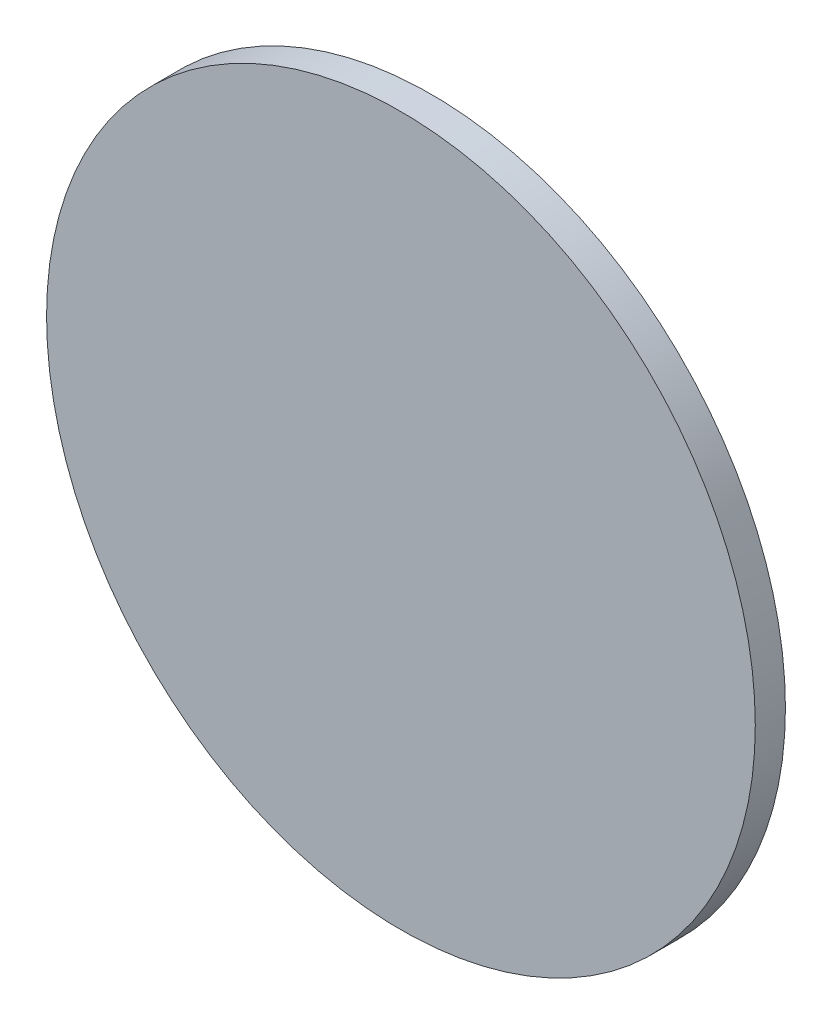
ISO-10303-21;
HEADER;
FILE_DESCRIPTION(('STEP AP214'),'2;1');
FILE_NAME('part.step','',(''),(''),'','','');
FILE_SCHEMA(('AUTOMOTIVE_DESIGN { 1 0 10303 214 1 1 1 1 }'));
ENDSEC;
DATA;
#1=APPLICATION_CONTEXT('core data for automotive mechanical design processes');
#2=APPLICATION_PROTOCOL_DEFINITION('international standard','automotive_design',2000,#1);
#3=PRODUCT_CONTEXT('',#1,'mechanical');
#4=PRODUCT('Part','Part','',(#3));
#5=PRODUCT_RELATED_PRODUCT_CATEGORY('part','',(#4));
#6=PRODUCT_DEFINITION_FORMATION('','',#4);
#7=PRODUCT_DEFINITION_CONTEXT('part definition',#1,'design');
#8=PRODUCT_DEFINITION('design','',#6,#7);
#9=PRODUCT_DEFINITION_SHAPE('','',#8);
#10=(LENGTH_UNIT() NAMED_UNIT(*) SI_UNIT(.MILLI.,.METRE.));
#11=(NAMED_UNIT(*) PLANE_ANGLE_UNIT() SI_UNIT($,.RADIAN.));
#12=(NAMED_UNIT(*) SI_UNIT($,.STERADIAN.) SOLID_ANGLE_UNIT());
#13=UNCERTAINTY_MEASURE_WITH_UNIT(LENGTH_MEASURE(1.E-05),#10,'distance_accuracy_value','');
#14=(GEOMETRIC_REPRESENTATION_CONTEXT(3) GLOBAL_UNCERTAINTY_ASSIGNED_CONTEXT((#13)) GLOBAL_UNIT_ASSIGNED_CONTEXT((#10,
#11,#12)) REPRESENTATION_CONTEXT('',''));
#15=CARTESIAN_POINT('',(0.,0.,0.));
#16=DIRECTION('',(0.,0.,1.));
#17=DIRECTION('',(1.,0.,0.));
#18=AXIS2_PLACEMENT_3D('',#15,#16,#17);
#19=CARTESIAN_POINT('',(0.,0.,0.81));
#20=DIRECTION('',(0.,0.,-1.));
#21=DIRECTION('',(-1.,0.,0.));
#22=AXIS2_PLACEMENT_3D('',#19,#20,#21);
#23=CYLINDRICAL_SURFACE('',#22,9.525);
#24=CARTESIAN_POINT('',(0.,0.,0.81));
#25=DIRECTION('',(0.,0.,1.));
#26=DIRECTION('',(1.,0.,0.));
#27=AXIS2_PLACEMENT_3D('',#24,#25,#26);
#28=CIRCLE('',#27,9.525);
#29=CARTESIAN_POINT('',(9.525,0.,0.81));
#30=VERTEX_POINT('',#29);
#31=EDGE_CURVE('E10',#30,#30,#28,.T.);
#32=ORIENTED_EDGE('',*,*,#31,.F.);
#33=EDGE_LOOP('',(#32));
#34=FACE_BOUND('',#33,.T.);
#35=CARTESIAN_POINT('',(0.,0.,0.));
#36=DIRECTION('',(0.,0.,1.));
#37=DIRECTION('',(1.,0.,0.));
#38=AXIS2_PLACEMENT_3D('',#35,#36,#37);
#39=CIRCLE('',#38,9.525);
#40=CARTESIAN_POINT('',(9.525,0.,0.));
#41=VERTEX_POINT('',#40);
#42=EDGE_CURVE('E31',#41,#41,#39,.T.);
#43=ORIENTED_EDGE('',*,*,#42,.T.);
#44=EDGE_LOOP('',(#43));
#45=FACE_BOUND('',#44,.T.);
#46=ADVANCED_FACE('F28',(#34,#45),#23,.T.);
#47=CARTESIAN_POINT('',(0.,0.,0.81));
#48=DIRECTION('',(0.,0.,1.));
#49=DIRECTION('',(1.,0.,0.));
#50=AXIS2_PLACEMENT_3D('',#47,#48,#49);
#51=PLANE('',#50);
#52=ORIENTED_EDGE('',*,*,#31,.T.);
#53=EDGE_LOOP('',(#52));
#54=FACE_BOUND('',#53,.T.);
#55=ADVANCED_FACE('F43',(#54),#51,.T.);
#56=CARTESIAN_POINT('',(0.,0.,0.));
#57=DIRECTION('',(0.,0.,1.));
#58=DIRECTION('',(1.,0.,0.));
#59=AXIS2_PLACEMENT_3D('',#56,#57,#58);
#60=PLANE('',#59);
#61=ORIENTED_EDGE('',*,*,#42,.F.);
#62=EDGE_LOOP('',(#61));
#63=FACE_BOUND('',#62,.T.);
#64=ADVANCED_FACE('F41',(#63),#60,.F.);
#65=CLOSED_SHELL('',(#46,#55,#64));
#66=MANIFOLD_SOLID_BREP('B2',#65);
#67=ADVANCED_BREP_SHAPE_REPRESENTATION('',(#18,#66),#14);
#68=SHAPE_DEFINITION_REPRESENTATION(#9,#67);
ENDSEC;
END-ISO-10303-21;
